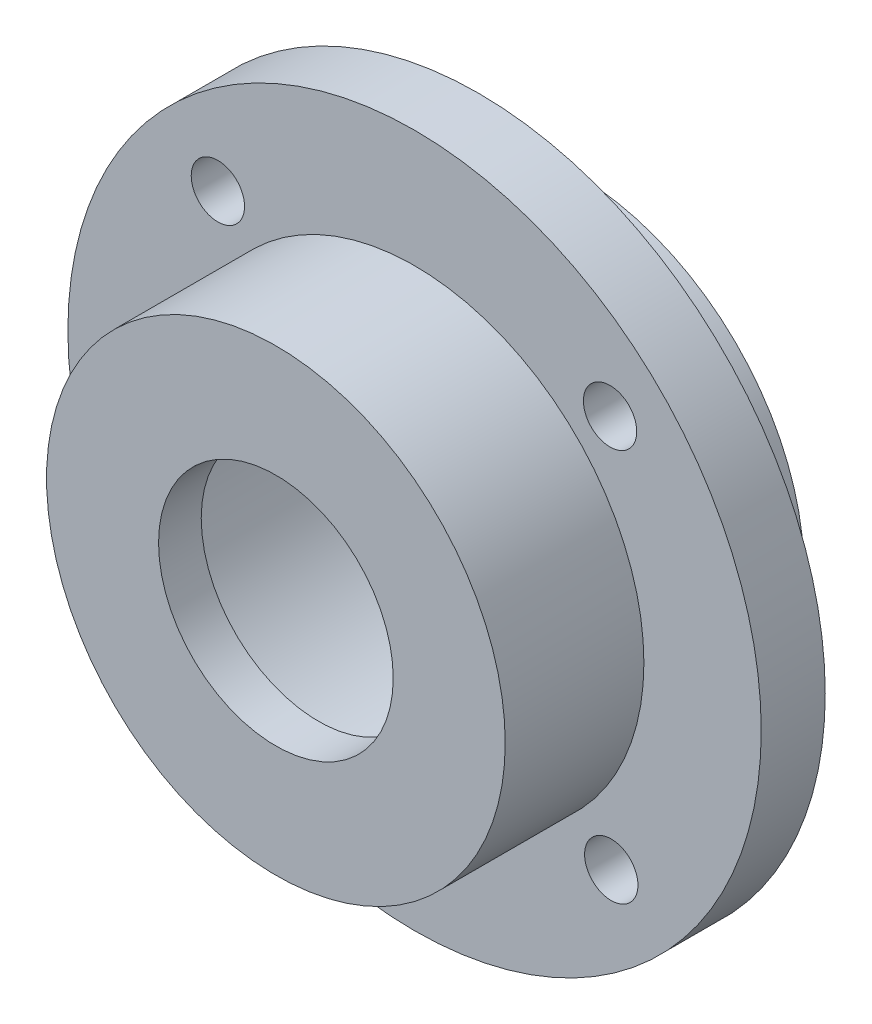
ISO-10303-21;
HEADER;
FILE_DESCRIPTION(('STEP AP214'),'2;1');
FILE_NAME('part.step','',(''),(''),'','','');
FILE_SCHEMA(('AUTOMOTIVE_DESIGN { 1 0 10303 214 1 1 1 1 }'));
ENDSEC;
DATA;
#1=APPLICATION_CONTEXT('core data for automotive mechanical design processes');
#2=APPLICATION_PROTOCOL_DEFINITION('international standard','automotive_design',2000,#1);
#3=PRODUCT_CONTEXT('',#1,'mechanical');
#4=PRODUCT('Part','Part','',(#3));
#5=PRODUCT_RELATED_PRODUCT_CATEGORY('part','',(#4));
#6=PRODUCT_DEFINITION_FORMATION('','',#4);
#7=PRODUCT_DEFINITION_CONTEXT('part definition',#1,'design');
#8=PRODUCT_DEFINITION('design','',#6,#7);
#9=PRODUCT_DEFINITION_SHAPE('','',#8);
#10=(LENGTH_UNIT() NAMED_UNIT(*) SI_UNIT(.MILLI.,.METRE.));
#11=(NAMED_UNIT(*) PLANE_ANGLE_UNIT() SI_UNIT($,.RADIAN.));
#12=(NAMED_UNIT(*) SI_UNIT($,.STERADIAN.) SOLID_ANGLE_UNIT());
#13=UNCERTAINTY_MEASURE_WITH_UNIT(LENGTH_MEASURE(1.E-05),#10,'distance_accuracy_value','');
#14=(GEOMETRIC_REPRESENTATION_CONTEXT(3) GLOBAL_UNCERTAINTY_ASSIGNED_CONTEXT((#13)) GLOBAL_UNIT_ASSIGNED_CONTEXT((#10,
#11,#12)) REPRESENTATION_CONTEXT('',''));
#15=CARTESIAN_POINT('',(0.,0.,0.));
#16=DIRECTION('',(0.,0.,1.));
#17=DIRECTION('',(1.,0.,0.));
#18=AXIS2_PLACEMENT_3D('',#15,#16,#17);
#19=CARTESIAN_POINT('',(0.,0.,24.));
#20=DIRECTION('',(0.,0.,-1.));
#21=DIRECTION('',(-1.,0.,0.));
#22=AXIS2_PLACEMENT_3D('',#19,#20,#21);
#23=CYLINDRICAL_SURFACE('',#22,32.5);
#24=CARTESIAN_POINT('',(0.,0.,15.));
#25=DIRECTION('',(0.,0.,1.));
#26=DIRECTION('',(1.,0.,0.));
#27=AXIS2_PLACEMENT_3D('',#24,#25,#26);
#28=CIRCLE('',#27,32.5);
#29=CARTESIAN_POINT('',(32.5,0.,15.));
#30=VERTEX_POINT('',#29);
#31=EDGE_CURVE('E37',#30,#30,#28,.T.);
#32=ORIENTED_EDGE('',*,*,#31,.F.);
#33=EDGE_LOOP('',(#32));
#34=FACE_BOUND('',#33,.T.);
#35=CARTESIAN_POINT('',(0.,0.,9.));
#36=DIRECTION('',(0.,0.,-1.));
#37=DIRECTION('',(-1.,0.,0.));
#38=AXIS2_PLACEMENT_3D('',#35,#36,#37);
#39=CIRCLE('',#38,32.5);
#40=CARTESIAN_POINT('',(-32.5,0.,9.));
#41=VERTEX_POINT('',#40);
#42=EDGE_CURVE('E55',#41,#41,#39,.T.);
#43=ORIENTED_EDGE('',*,*,#42,.F.);
#44=EDGE_LOOP('',(#43));
#45=FACE_BOUND('',#44,.T.);
#46=ADVANCED_FACE('F30',(#34,#45),#23,.T.);
#47=CARTESIAN_POINT('',(-18.4388091374469,18.3277315633269,24.));
#48=DIRECTION('',(0.,0.,-1.));
#49=DIRECTION('',(-1.,0.,0.));
#50=AXIS2_PLACEMENT_3D('',#47,#48,#49);
#51=CYLINDRICAL_SURFACE('',#50,2.5);
#52=CARTESIAN_POINT('',(-18.4388091374469,18.3277315633269,15.));
#53=DIRECTION('',(0.,0.,1.));
#54=DIRECTION('',(1.,0.,0.));
#55=AXIS2_PLACEMENT_3D('',#52,#53,#54);
#56=CIRCLE('',#55,2.5);
#57=CARTESIAN_POINT('',(-15.9388091374469,18.3277315633269,15.));
#58=VERTEX_POINT('',#57);
#59=EDGE_CURVE('E42',#58,#58,#56,.T.);
#60=ORIENTED_EDGE('',*,*,#59,.T.);
#61=EDGE_LOOP('',(#60));
#62=FACE_BOUND('',#61,.T.);
#63=CARTESIAN_POINT('',(-18.4388091374469,18.3277315633269,9.));
#64=DIRECTION('',(0.,0.,-1.));
#65=DIRECTION('',(-1.,0.,0.));
#66=AXIS2_PLACEMENT_3D('',#63,#64,#65);
#67=CIRCLE('',#66,2.5);
#68=CARTESIAN_POINT('',(-20.9388091374469,18.3277315633269,9.));
#69=VERTEX_POINT('',#68);
#70=EDGE_CURVE('E60',#69,#69,#67,.T.);
#71=ORIENTED_EDGE('',*,*,#70,.T.);
#72=EDGE_LOOP('',(#71));
#73=FACE_BOUND('',#72,.T.);
#74=ADVANCED_FACE('F68',(#62,#73),#51,.F.);
#75=CARTESIAN_POINT('',(18.3277315633267,18.4388091374471,24.));
#76=DIRECTION('',(0.,0.,-1.));
#77=DIRECTION('',(-1.,0.,0.));
#78=AXIS2_PLACEMENT_3D('',#75,#76,#77);
#79=CYLINDRICAL_SURFACE('',#78,2.50000000000001);
#80=CARTESIAN_POINT('',(18.3277315633267,18.4388091374471,15.));
#81=DIRECTION('',(0.,0.,1.));
#82=DIRECTION('',(1.,0.,0.));
#83=AXIS2_PLACEMENT_3D('',#80,#81,#82);
#84=CIRCLE('',#83,2.50000000000001);
#85=CARTESIAN_POINT('',(20.8277315633267,18.4388091374471,15.));
#86=VERTEX_POINT('',#85);
#87=EDGE_CURVE('E52',#86,#86,#84,.T.);
#88=ORIENTED_EDGE('',*,*,#87,.T.);
#89=EDGE_LOOP('',(#88));
#90=FACE_BOUND('',#89,.T.);
#91=CARTESIAN_POINT('',(18.3277315633267,18.4388091374471,9.));
#92=DIRECTION('',(0.,0.,-1.));
#93=DIRECTION('',(-1.,0.,0.));
#94=AXIS2_PLACEMENT_3D('',#91,#92,#93);
#95=CIRCLE('',#94,2.50000000000001);
#96=CARTESIAN_POINT('',(15.8277315633267,18.4388091374471,9.));
#97=VERTEX_POINT('',#96);
#98=EDGE_CURVE('E137',#97,#97,#95,.T.);
#99=ORIENTED_EDGE('',*,*,#98,.T.);
#100=EDGE_LOOP('',(#99));
#101=FACE_BOUND('',#100,.T.);
#102=ADVANCED_FACE('F108',(#90,#101),#79,.F.);
#103=CARTESIAN_POINT('',(18.438809137447,-18.3277315633268,24.));
#104=DIRECTION('',(0.,0.,-1.));
#105=DIRECTION('',(-1.,0.,0.));
#106=AXIS2_PLACEMENT_3D('',#103,#104,#105);
#107=CYLINDRICAL_SURFACE('',#106,2.49999999999999);
#108=CARTESIAN_POINT('',(18.438809137447,-18.3277315633268,15.));
#109=DIRECTION('',(0.,0.,1.));
#110=DIRECTION('',(1.,0.,0.));
#111=AXIS2_PLACEMENT_3D('',#108,#109,#110);
#112=CIRCLE('',#111,2.49999999999999);
#113=CARTESIAN_POINT('',(20.938809137447,-18.3277315633268,15.));
#114=VERTEX_POINT('',#113);
#115=EDGE_CURVE('E47',#114,#114,#112,.T.);
#116=ORIENTED_EDGE('',*,*,#115,.T.);
#117=EDGE_LOOP('',(#116));
#118=FACE_BOUND('',#117,.T.);
#119=CARTESIAN_POINT('',(18.438809137447,-18.3277315633268,9.));
#120=DIRECTION('',(0.,0.,-1.));
#121=DIRECTION('',(-1.,0.,0.));
#122=AXIS2_PLACEMENT_3D('',#119,#120,#121);
#123=CIRCLE('',#122,2.49999999999999);
#124=CARTESIAN_POINT('',(15.938809137447,-18.3277315633268,9.));
#125=VERTEX_POINT('',#124);
#126=EDGE_CURVE('E134',#125,#125,#123,.T.);
#127=ORIENTED_EDGE('',*,*,#126,.T.);
#128=EDGE_LOOP('',(#127));
#129=FACE_BOUND('',#128,.T.);
#130=ADVANCED_FACE('F105',(#118,#129),#107,.F.);
#131=CARTESIAN_POINT('',(-18.3277315633268,-18.438809137447,24.));
#132=DIRECTION('',(0.,0.,-1.));
#133=DIRECTION('',(-1.,0.,0.));
#134=AXIS2_PLACEMENT_3D('',#131,#132,#133);
#135=CYLINDRICAL_SURFACE('',#134,2.5);
#136=CARTESIAN_POINT('',(-18.3277315633268,-18.438809137447,15.));
#137=DIRECTION('',(0.,0.,1.));
#138=DIRECTION('',(1.,0.,0.));
#139=AXIS2_PLACEMENT_3D('',#136,#137,#138);
#140=CIRCLE('',#139,2.5);
#141=CARTESIAN_POINT('',(-15.8277315633268,-18.438809137447,15.));
#142=VERTEX_POINT('',#141);
#143=EDGE_CURVE('E45',#142,#142,#140,.T.);
#144=ORIENTED_EDGE('',*,*,#143,.T.);
#145=EDGE_LOOP('',(#144));
#146=FACE_BOUND('',#145,.T.);
#147=CARTESIAN_POINT('',(-18.3277315633268,-18.438809137447,9.));
#148=DIRECTION('',(0.,0.,-1.));
#149=DIRECTION('',(-1.,0.,0.));
#150=AXIS2_PLACEMENT_3D('',#147,#148,#149);
#151=CIRCLE('',#150,2.5);
#152=CARTESIAN_POINT('',(-20.8277315633268,-18.438809137447,9.));
#153=VERTEX_POINT('',#152);
#154=EDGE_CURVE('E33',#153,#153,#151,.T.);
#155=ORIENTED_EDGE('',*,*,#154,.T.);
#156=EDGE_LOOP('',(#155));
#157=FACE_BOUND('',#156,.T.);
#158=ADVANCED_FACE('F101',(#146,#157),#135,.F.);
#159=CARTESIAN_POINT('',(0.,0.,0.));
#160=DIRECTION('',(0.,0.,1.));
#161=DIRECTION('',(1.,0.,0.));
#162=AXIS2_PLACEMENT_3D('',#159,#160,#161);
#163=PLANE('',#162);
#164=CARTESIAN_POINT('',(0.,0.,0.));
#165=DIRECTION('',(0.,0.,1.));
#166=DIRECTION('',(1.,0.,0.));
#167=AXIS2_PLACEMENT_3D('',#164,#165,#166);
#168=CIRCLE('',#167,17.5);
#169=CARTESIAN_POINT('',(17.5,0.,0.));
#170=VERTEX_POINT('',#169);
#171=EDGE_CURVE('E10',#170,#170,#168,.T.);
#172=ORIENTED_EDGE('',*,*,#171,.T.);
#173=EDGE_LOOP('',(#172));
#174=FACE_BOUND('',#173,.T.);
#175=CARTESIAN_POINT('',(0.,0.,0.));
#176=DIRECTION('',(0.,0.,-1.));
#177=DIRECTION('',(-1.,0.,0.));
#178=AXIS2_PLACEMENT_3D('',#175,#176,#177);
#179=CIRCLE('',#178,21.5);
#180=CARTESIAN_POINT('',(-21.5,0.,0.));
#181=VERTEX_POINT('',#180);
#182=EDGE_CURVE('E123',#181,#181,#179,.T.);
#183=ORIENTED_EDGE('',*,*,#182,.T.);
#184=EDGE_LOOP('',(#183));
#185=FACE_BOUND('',#184,.T.);
#186=ADVANCED_FACE('F104',(#174,#185),#163,.F.);
#187=CARTESIAN_POINT('',(0.,0.,24.));
#188=DIRECTION('',(0.,0.,-1.));
#189=DIRECTION('',(-1.,0.,0.));
#190=AXIS2_PLACEMENT_3D('',#187,#188,#189);
#191=CYLINDRICAL_SURFACE('',#190,17.5);
#192=CARTESIAN_POINT('',(0.,0.,24.));
#193=DIRECTION('',(0.,0.,1.));
#194=DIRECTION('',(1.,0.,0.));
#195=AXIS2_PLACEMENT_3D('',#192,#193,#194);
#196=CIRCLE('',#195,17.5);
#197=CARTESIAN_POINT('',(17.5,0.,24.));
#198=VERTEX_POINT('',#197);
#199=EDGE_CURVE('E126',#198,#198,#196,.T.);
#200=ORIENTED_EDGE('',*,*,#199,.T.);
#201=EDGE_LOOP('',(#200));
#202=FACE_BOUND('',#201,.T.);
#203=ORIENTED_EDGE('',*,*,#171,.F.);
#204=EDGE_LOOP('',(#203));
#205=FACE_BOUND('',#204,.T.);
#206=ADVANCED_FACE('F75',(#202,#205),#191,.F.);
#207=CARTESIAN_POINT('',(0.,0.,15.));
#208=DIRECTION('',(0.,0.,1.));
#209=DIRECTION('',(1.,0.,0.));
#210=AXIS2_PLACEMENT_3D('',#207,#208,#209);
#211=PLANE('',#210);
#212=CARTESIAN_POINT('',(0.,0.,15.));
#213=DIRECTION('',(0.,0.,1.));
#214=DIRECTION('',(1.,0.,0.));
#215=AXIS2_PLACEMENT_3D('',#212,#213,#214);
#216=CIRCLE('',#215,21.5);
#217=CARTESIAN_POINT('',(21.5,0.,15.));
#218=VERTEX_POINT('',#217);
#219=EDGE_CURVE('E48',#218,#218,#216,.T.);
#220=ORIENTED_EDGE('',*,*,#219,.F.);
#221=EDGE_LOOP('',(#220));
#222=FACE_BOUND('',#221,.T.);
#223=ORIENTED_EDGE('',*,*,#143,.F.);
#224=EDGE_LOOP('',(#223));
#225=FACE_BOUND('',#224,.T.);
#226=ORIENTED_EDGE('',*,*,#115,.F.);
#227=EDGE_LOOP('',(#226));
#228=FACE_BOUND('',#227,.T.);
#229=ORIENTED_EDGE('',*,*,#87,.F.);
#230=EDGE_LOOP('',(#229));
#231=FACE_BOUND('',#230,.T.);
#232=ORIENTED_EDGE('',*,*,#59,.F.);
#233=EDGE_LOOP('',(#232));
#234=FACE_BOUND('',#233,.T.);
#235=ORIENTED_EDGE('',*,*,#31,.T.);
#236=EDGE_LOOP('',(#235));
#237=FACE_BOUND('',#236,.T.);
#238=ADVANCED_FACE('F71',(#222,#225,#228,#231,#234,#237),#211,.T.);
#239=CARTESIAN_POINT('',(0.,0.,15.));
#240=DIRECTION('',(0.,0.,1.));
#241=DIRECTION('',(1.,0.,0.));
#242=AXIS2_PLACEMENT_3D('',#239,#240,#241);
#243=CYLINDRICAL_SURFACE('',#242,21.5);
#244=ORIENTED_EDGE('',*,*,#219,.T.);
#245=EDGE_LOOP('',(#244));
#246=FACE_BOUND('',#245,.T.);
#247=CARTESIAN_POINT('',(0.,0.,28.));
#248=DIRECTION('',(0.,0.,1.));
#249=DIRECTION('',(1.,0.,0.));
#250=AXIS2_PLACEMENT_3D('',#247,#248,#249);
#251=CIRCLE('',#250,21.5);
#252=CARTESIAN_POINT('',(21.5,0.,28.));
#253=VERTEX_POINT('',#252);
#254=EDGE_CURVE('E131',#253,#253,#251,.T.);
#255=ORIENTED_EDGE('',*,*,#254,.F.);
#256=EDGE_LOOP('',(#255));
#257=FACE_BOUND('',#256,.T.);
#258=ADVANCED_FACE('F74',(#246,#257),#243,.T.);
#259=CARTESIAN_POINT('',(0.,0.,9.));
#260=DIRECTION('',(0.,0.,-1.));
#261=DIRECTION('',(-1.,0.,0.));
#262=AXIS2_PLACEMENT_3D('',#259,#260,#261);
#263=PLANE('',#262);
#264=CARTESIAN_POINT('',(0.,0.,9.));
#265=DIRECTION('',(0.,0.,-1.));
#266=DIRECTION('',(-1.,0.,0.));
#267=AXIS2_PLACEMENT_3D('',#264,#265,#266);
#268=CIRCLE('',#267,21.5);
#269=CARTESIAN_POINT('',(-21.5,0.,9.));
#270=VERTEX_POINT('',#269);
#271=EDGE_CURVE('E125',#270,#270,#268,.T.);
#272=ORIENTED_EDGE('',*,*,#271,.F.);
#273=EDGE_LOOP('',(#272));
#274=FACE_BOUND('',#273,.T.);
#275=ORIENTED_EDGE('',*,*,#154,.F.);
#276=EDGE_LOOP('',(#275));
#277=FACE_BOUND('',#276,.T.);
#278=ORIENTED_EDGE('',*,*,#126,.F.);
#279=EDGE_LOOP('',(#278));
#280=FACE_BOUND('',#279,.T.);
#281=ORIENTED_EDGE('',*,*,#98,.F.);
#282=EDGE_LOOP('',(#281));
#283=FACE_BOUND('',#282,.T.);
#284=ORIENTED_EDGE('',*,*,#70,.F.);
#285=EDGE_LOOP('',(#284));
#286=FACE_BOUND('',#285,.T.);
#287=ORIENTED_EDGE('',*,*,#42,.T.);
#288=EDGE_LOOP('',(#287));
#289=FACE_BOUND('',#288,.T.);
#290=ADVANCED_FACE('F84',(#274,#277,#280,#283,#286,#289),#263,.T.);
#291=CARTESIAN_POINT('',(0.,0.,9.));
#292=DIRECTION('',(0.,0.,-1.));
#293=DIRECTION('',(-1.,0.,0.));
#294=AXIS2_PLACEMENT_3D('',#291,#292,#293);
#295=CYLINDRICAL_SURFACE('',#294,21.5);
#296=ORIENTED_EDGE('',*,*,#271,.T.);
#297=EDGE_LOOP('',(#296));
#298=FACE_BOUND('',#297,.T.);
#299=ORIENTED_EDGE('',*,*,#182,.F.);
#300=EDGE_LOOP('',(#299));
#301=FACE_BOUND('',#300,.T.);
#302=ADVANCED_FACE('F86',(#298,#301),#295,.T.);
#303=CARTESIAN_POINT('',(0.,0.,28.));
#304=DIRECTION('',(0.,0.,1.));
#305=DIRECTION('',(1.,0.,0.));
#306=AXIS2_PLACEMENT_3D('',#303,#304,#305);
#307=PLANE('',#306);
#308=ORIENTED_EDGE('',*,*,#254,.T.);
#309=EDGE_LOOP('',(#308));
#310=FACE_BOUND('',#309,.T.);
#311=CARTESIAN_POINT('',(0.,0.,28.));
#312=DIRECTION('',(0.,0.,1.));
#313=DIRECTION('',(1.,0.,0.));
#314=AXIS2_PLACEMENT_3D('',#311,#312,#313);
#315=CIRCLE('',#314,11.);
#316=CARTESIAN_POINT('',(11.,0.,28.));
#317=VERTEX_POINT('',#316);
#318=EDGE_CURVE('E154',#317,#317,#315,.T.);
#319=ORIENTED_EDGE('',*,*,#318,.F.);
#320=EDGE_LOOP('',(#319));
#321=FACE_BOUND('',#320,.T.);
#322=ADVANCED_FACE('F93',(#310,#321),#307,.T.);
#323=CARTESIAN_POINT('',(0.,0.,24.));
#324=DIRECTION('',(0.,0.,1.));
#325=DIRECTION('',(1.,0.,0.));
#326=AXIS2_PLACEMENT_3D('',#323,#324,#325);
#327=PLANE('',#326);
#328=ORIENTED_EDGE('',*,*,#199,.F.);
#329=EDGE_LOOP('',(#328));
#330=FACE_BOUND('',#329,.T.);
#331=CARTESIAN_POINT('',(0.,0.,24.));
#332=DIRECTION('',(0.,0.,1.));
#333=DIRECTION('',(1.,0.,0.));
#334=AXIS2_PLACEMENT_3D('',#331,#332,#333);
#335=CIRCLE('',#334,11.);
#336=CARTESIAN_POINT('',(11.,0.,24.));
#337=VERTEX_POINT('',#336);
#338=EDGE_CURVE('E155',#337,#337,#335,.T.);
#339=ORIENTED_EDGE('',*,*,#338,.T.);
#340=EDGE_LOOP('',(#339));
#341=FACE_BOUND('',#340,.T.);
#342=ADVANCED_FACE('F165',(#330,#341),#327,.F.);
#343=CARTESIAN_POINT('',(0.,0.,28.));
#344=DIRECTION('',(0.,0.,-1.));
#345=DIRECTION('',(-1.,0.,0.));
#346=AXIS2_PLACEMENT_3D('',#343,#344,#345);
#347=CYLINDRICAL_SURFACE('',#346,11.);
#348=ORIENTED_EDGE('',*,*,#318,.T.);
#349=EDGE_LOOP('',(#348));
#350=FACE_BOUND('',#349,.T.);
#351=ORIENTED_EDGE('',*,*,#338,.F.);
#352=EDGE_LOOP('',(#351));
#353=FACE_BOUND('',#352,.T.);
#354=ADVANCED_FACE('F161',(#350,#353),#347,.F.);
#355=CLOSED_SHELL('',(#46,#74,#102,#130,#158,#186,#206,#238,#258,#290,#302,#322,#342,#354));
#356=MANIFOLD_SOLID_BREP('B2',#355);
#357=ADVANCED_BREP_SHAPE_REPRESENTATION('',(#18,#356),#14);
#358=SHAPE_DEFINITION_REPRESENTATION(#9,#357);
ENDSEC;
END-ISO-10303-21;
